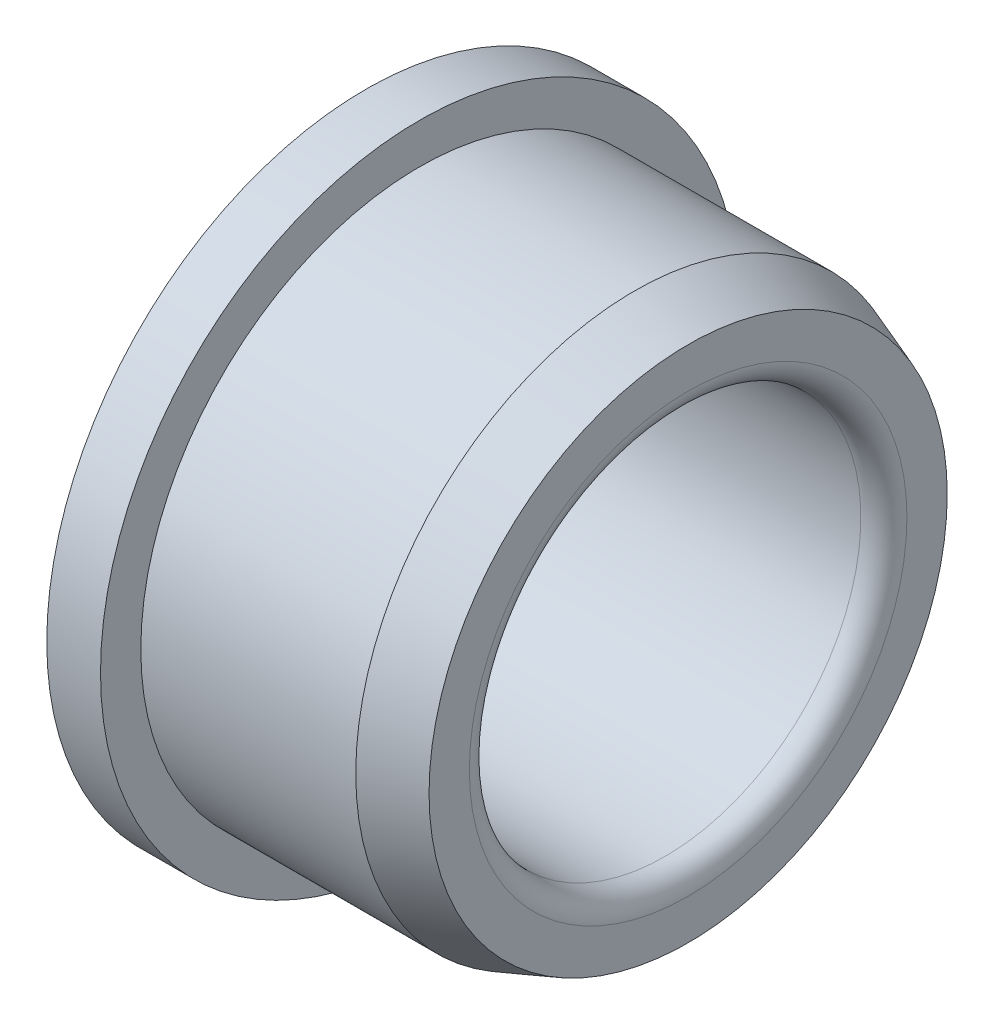
ISO-10303-21;
HEADER;
FILE_DESCRIPTION(('STEP AP214'),'2;1');
FILE_NAME('part.step','',(''),(''),'','','');
FILE_SCHEMA(('AUTOMOTIVE_DESIGN { 1 0 10303 214 1 1 1 1 }'));
ENDSEC;
DATA;
#1=APPLICATION_CONTEXT('core data for automotive mechanical design processes');
#2=APPLICATION_PROTOCOL_DEFINITION('international standard','automotive_design',2000,#1);
#3=PRODUCT_CONTEXT('',#1,'mechanical');
#4=PRODUCT('Part','Part','',(#3));
#5=PRODUCT_RELATED_PRODUCT_CATEGORY('part','',(#4));
#6=PRODUCT_DEFINITION_FORMATION('','',#4);
#7=PRODUCT_DEFINITION_CONTEXT('part definition',#1,'design');
#8=PRODUCT_DEFINITION('design','',#6,#7);
#9=PRODUCT_DEFINITION_SHAPE('','',#8);
#10=(LENGTH_UNIT() NAMED_UNIT(*) SI_UNIT(.MILLI.,.METRE.));
#11=(NAMED_UNIT(*) PLANE_ANGLE_UNIT() SI_UNIT($,.RADIAN.));
#12=(NAMED_UNIT(*) SI_UNIT($,.STERADIAN.) SOLID_ANGLE_UNIT());
#13=UNCERTAINTY_MEASURE_WITH_UNIT(LENGTH_MEASURE(1.E-05),#10,'distance_accuracy_value','');
#14=(GEOMETRIC_REPRESENTATION_CONTEXT(3) GLOBAL_UNCERTAINTY_ASSIGNED_CONTEXT((#13)) GLOBAL_UNIT_ASSIGNED_CONTEXT((#10,
#11,#12)) REPRESENTATION_CONTEXT('',''));
#15=CARTESIAN_POINT('',(0.,0.,0.));
#16=DIRECTION('',(0.,0.,1.));
#17=DIRECTION('',(1.,0.,0.));
#18=AXIS2_PLACEMENT_3D('',#15,#16,#17);
#19=CARTESIAN_POINT('',(1.,0.,0.));
#20=DIRECTION('',(-1.,0.,0.));
#21=DIRECTION('',(0.,0.,1.));
#22=AXIS2_PLACEMENT_3D('',#19,#20,#21);
#23=TOROIDAL_SURFACE('',#22,9.5,1.);
#24=CARTESIAN_POINT('',(1.,0.,0.));
#25=DIRECTION('',(-1.,0.,0.));
#26=DIRECTION('',(0.,0.,1.));
#27=AXIS2_PLACEMENT_3D('',#24,#25,#26);
#28=CIRCLE('',#27,8.5);
#29=CARTESIAN_POINT('',(1.,0.,8.5));
#30=VERTEX_POINT('',#29);
#31=EDGE_CURVE('E10',#30,#30,#28,.T.);
#32=ORIENTED_EDGE('',*,*,#31,.F.);
#33=EDGE_LOOP('',(#32));
#34=FACE_BOUND('',#33,.T.);
#35=CARTESIAN_POINT('',(0.,0.,0.));
#36=DIRECTION('',(-1.,0.,0.));
#37=DIRECTION('',(0.,0.,1.));
#38=AXIS2_PLACEMENT_3D('',#35,#36,#37);
#39=CIRCLE('',#38,9.5);
#40=CARTESIAN_POINT('',(0.,0.,9.5));
#41=VERTEX_POINT('',#40);
#42=EDGE_CURVE('E46',#41,#41,#39,.T.);
#43=ORIENTED_EDGE('',*,*,#42,.T.);
#44=EDGE_LOOP('',(#43));
#45=FACE_BOUND('',#44,.T.);
#46=ADVANCED_FACE('F15',(#34,#45),#23,.T.);
#47=CARTESIAN_POINT('',(0.,0.,0.));
#48=DIRECTION('',(-1.,0.,0.));
#49=DIRECTION('',(0.,0.,1.));
#50=AXIS2_PLACEMENT_3D('',#47,#48,#49);
#51=CYLINDRICAL_SURFACE('',#50,8.5);
#52=CARTESIAN_POINT('',(13.,0.,0.));
#53=DIRECTION('',(-1.,0.,0.));
#54=DIRECTION('',(0.,0.,1.));
#55=AXIS2_PLACEMENT_3D('',#52,#53,#54);
#56=CIRCLE('',#55,8.5);
#57=CARTESIAN_POINT('',(13.,0.,8.5));
#58=VERTEX_POINT('',#57);
#59=EDGE_CURVE('E21',#58,#58,#56,.T.);
#60=ORIENTED_EDGE('',*,*,#59,.F.);
#61=EDGE_LOOP('',(#60));
#62=FACE_BOUND('',#61,.T.);
#63=ORIENTED_EDGE('',*,*,#31,.T.);
#64=EDGE_LOOP('',(#63));
#65=FACE_BOUND('',#64,.T.);
#66=ADVANCED_FACE('F90',(#62,#65),#51,.F.);
#67=CARTESIAN_POINT('',(13.,0.,0.));
#68=DIRECTION('',(-1.,0.,0.));
#69=DIRECTION('',(0.,0.,1.));
#70=AXIS2_PLACEMENT_3D('',#67,#68,#69);
#71=TOROIDAL_SURFACE('',#70,9.5,1.);
#72=CARTESIAN_POINT('',(14.,0.,0.));
#73=DIRECTION('',(-1.,0.,0.));
#74=DIRECTION('',(0.,0.,1.));
#75=AXIS2_PLACEMENT_3D('',#72,#73,#74);
#76=CIRCLE('',#75,9.5);
#77=CARTESIAN_POINT('',(14.,0.,9.5));
#78=VERTEX_POINT('',#77);
#79=EDGE_CURVE('E25',#78,#78,#76,.T.);
#80=ORIENTED_EDGE('',*,*,#79,.F.);
#81=EDGE_LOOP('',(#80));
#82=FACE_BOUND('',#81,.T.);
#83=ORIENTED_EDGE('',*,*,#59,.T.);
#84=EDGE_LOOP('',(#83));
#85=FACE_BOUND('',#84,.T.);
#86=ADVANCED_FACE('F83',(#82,#85),#71,.T.);
#87=CARTESIAN_POINT('',(14.,11.2507361200455,0.));
#88=DIRECTION('',(1.,0.,0.));
#89=DIRECTION('',(0.,0.,-1.));
#90=AXIS2_PLACEMENT_3D('',#87,#88,#89);
#91=PLANE('',#90);
#92=ORIENTED_EDGE('',*,*,#79,.T.);
#93=EDGE_LOOP('',(#92));
#94=FACE_BOUND('',#93,.T.);
#95=CARTESIAN_POINT('',(14.,0.,0.));
#96=DIRECTION('',(-1.,0.,0.));
#97=DIRECTION('',(0.,0.,1.));
#98=AXIS2_PLACEMENT_3D('',#95,#96,#97);
#99=CIRCLE('',#98,11.2507361200455);
#100=CARTESIAN_POINT('',(14.,0.,11.2507361200455));
#101=VERTEX_POINT('',#100);
#102=EDGE_CURVE('E29',#101,#101,#99,.T.);
#103=ORIENTED_EDGE('',*,*,#102,.F.);
#104=EDGE_LOOP('',(#103));
#105=FACE_BOUND('',#104,.T.);
#106=ADVANCED_FACE('F78',(#94,#105),#91,.T.);
#107=CARTESIAN_POINT('',(14.,0.,0.));
#108=DIRECTION('',(-1.,0.,0.));
#109=DIRECTION('',(0.,0.,1.));
#110=AXIS2_PLACEMENT_3D('',#107,#108,#109);
#111=CONICAL_SURFACE('',#110,11.2507361200455,0.349065850398866);
#112=CARTESIAN_POINT('',(11.6666666666667,0.,0.));
#113=DIRECTION('',(-1.,0.,0.));
#114=DIRECTION('',(0.,0.,1.));
#115=AXIS2_PLACEMENT_3D('',#112,#113,#114);
#116=CIRCLE('',#115,12.1);
#117=CARTESIAN_POINT('',(11.6666666666667,0.,12.1));
#118=VERTEX_POINT('',#117);
#119=EDGE_CURVE('E34',#118,#118,#116,.T.);
#120=ORIENTED_EDGE('',*,*,#119,.F.);
#121=EDGE_LOOP('',(#120));
#122=FACE_BOUND('',#121,.T.);
#123=ORIENTED_EDGE('',*,*,#102,.T.);
#124=EDGE_LOOP('',(#123));
#125=FACE_BOUND('',#124,.T.);
#126=ADVANCED_FACE('F72',(#122,#125),#111,.T.);
#127=CARTESIAN_POINT('',(0.,0.,0.));
#128=DIRECTION('',(-1.,0.,0.));
#129=DIRECTION('',(0.,0.,1.));
#130=AXIS2_PLACEMENT_3D('',#127,#128,#129);
#131=CYLINDRICAL_SURFACE('',#130,12.1);
#132=CARTESIAN_POINT('',(2.33333333333333,0.,0.));
#133=DIRECTION('',(-1.,0.,0.));
#134=DIRECTION('',(0.,0.,1.));
#135=AXIS2_PLACEMENT_3D('',#132,#133,#134);
#136=CIRCLE('',#135,12.1);
#137=CARTESIAN_POINT('',(2.33333333333333,0.,12.1));
#138=VERTEX_POINT('',#137);
#139=EDGE_CURVE('E37',#138,#138,#136,.T.);
#140=ORIENTED_EDGE('',*,*,#139,.F.);
#141=EDGE_LOOP('',(#140));
#142=FACE_BOUND('',#141,.T.);
#143=ORIENTED_EDGE('',*,*,#119,.T.);
#144=EDGE_LOOP('',(#143));
#145=FACE_BOUND('',#144,.T.);
#146=ADVANCED_FACE('F66',(#142,#145),#131,.T.);
#147=CARTESIAN_POINT('',(2.33333333333333,12.1,0.));
#148=DIRECTION('',(-1.,0.,0.));
#149=DIRECTION('',(0.,0.,1.));
#150=AXIS2_PLACEMENT_3D('',#147,#148,#149);
#151=PLANE('',#150);
#152=CARTESIAN_POINT('',(2.33333333333333,0.,0.));
#153=DIRECTION('',(-1.,0.,0.));
#154=DIRECTION('',(0.,0.,1.));
#155=AXIS2_PLACEMENT_3D('',#152,#153,#154);
#156=CIRCLE('',#155,13.85);
#157=CARTESIAN_POINT('',(2.33333333333333,0.,13.85));
#158=VERTEX_POINT('',#157);
#159=EDGE_CURVE('E40',#158,#158,#156,.T.);
#160=ORIENTED_EDGE('',*,*,#159,.F.);
#161=EDGE_LOOP('',(#160));
#162=FACE_BOUND('',#161,.T.);
#163=ORIENTED_EDGE('',*,*,#139,.T.);
#164=EDGE_LOOP('',(#163));
#165=FACE_BOUND('',#164,.T.);
#166=ADVANCED_FACE('F60',(#162,#165),#151,.F.);
#167=CARTESIAN_POINT('',(0.,0.,0.));
#168=DIRECTION('',(-1.,0.,0.));
#169=DIRECTION('',(0.,0.,1.));
#170=AXIS2_PLACEMENT_3D('',#167,#168,#169);
#171=CYLINDRICAL_SURFACE('',#170,13.85);
#172=CARTESIAN_POINT('',(0.,0.,0.));
#173=DIRECTION('',(-1.,0.,0.));
#174=DIRECTION('',(0.,0.,1.));
#175=AXIS2_PLACEMENT_3D('',#172,#173,#174);
#176=CIRCLE('',#175,13.85);
#177=CARTESIAN_POINT('',(0.,0.,13.85));
#178=VERTEX_POINT('',#177);
#179=EDGE_CURVE('E43',#178,#178,#176,.T.);
#180=ORIENTED_EDGE('',*,*,#179,.F.);
#181=EDGE_LOOP('',(#180));
#182=FACE_BOUND('',#181,.T.);
#183=ORIENTED_EDGE('',*,*,#159,.T.);
#184=EDGE_LOOP('',(#183));
#185=FACE_BOUND('',#184,.T.);
#186=ADVANCED_FACE('F54',(#182,#185),#171,.T.);
#187=CARTESIAN_POINT('',(0.,13.85,0.));
#188=DIRECTION('',(1.,0.,0.));
#189=DIRECTION('',(0.,0.,-1.));
#190=AXIS2_PLACEMENT_3D('',#187,#188,#189);
#191=PLANE('',#190);
#192=ORIENTED_EDGE('',*,*,#42,.F.);
#193=EDGE_LOOP('',(#192));
#194=FACE_BOUND('',#193,.T.);
#195=ORIENTED_EDGE('',*,*,#179,.T.);
#196=EDGE_LOOP('',(#195));
#197=FACE_BOUND('',#196,.T.);
#198=ADVANCED_FACE('F51',(#194,#197),#191,.F.);
#199=CLOSED_SHELL('',(#46,#66,#86,#106,#126,#146,#166,#186,#198));
#200=MANIFOLD_SOLID_BREP('B1',#199);
#201=ADVANCED_BREP_SHAPE_REPRESENTATION('',(#18,#200),#14);
#202=SHAPE_DEFINITION_REPRESENTATION(#9,#201);
ENDSEC;
END-ISO-10303-21;
